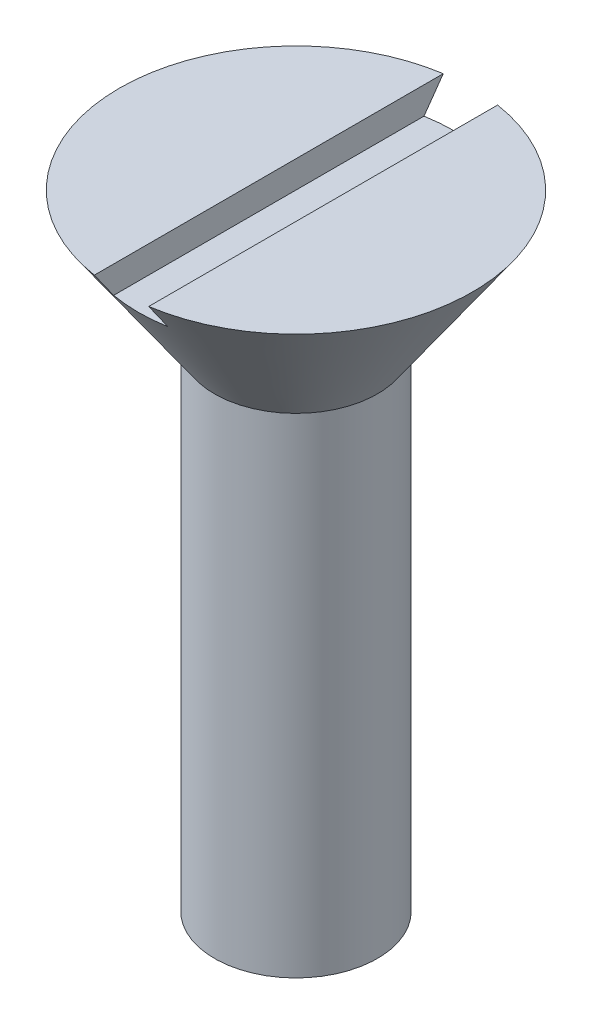
ISO-10303-21;
HEADER;
FILE_DESCRIPTION(('STEP AP214'),'2;1');
FILE_NAME('part.step','',(''),(''),'','','');
FILE_SCHEMA(('AUTOMOTIVE_DESIGN { 1 0 10303 214 1 1 1 1 }'));
ENDSEC;
DATA;
#1=APPLICATION_CONTEXT('core data for automotive mechanical design processes');
#2=APPLICATION_PROTOCOL_DEFINITION('international standard','automotive_design',2000,#1);
#3=PRODUCT_CONTEXT('',#1,'mechanical');
#4=PRODUCT('Part','Part','',(#3));
#5=PRODUCT_RELATED_PRODUCT_CATEGORY('part','',(#4));
#6=PRODUCT_DEFINITION_FORMATION('','',#4);
#7=PRODUCT_DEFINITION_CONTEXT('part definition',#1,'design');
#8=PRODUCT_DEFINITION('design','',#6,#7);
#9=PRODUCT_DEFINITION_SHAPE('','',#8);
#10=(LENGTH_UNIT() NAMED_UNIT(*) SI_UNIT(.MILLI.,.METRE.));
#11=(NAMED_UNIT(*) PLANE_ANGLE_UNIT() SI_UNIT($,.RADIAN.));
#12=(NAMED_UNIT(*) SI_UNIT($,.STERADIAN.) SOLID_ANGLE_UNIT());
#13=UNCERTAINTY_MEASURE_WITH_UNIT(LENGTH_MEASURE(1.E-05),#10,'distance_accuracy_value','');
#14=(GEOMETRIC_REPRESENTATION_CONTEXT(3) GLOBAL_UNCERTAINTY_ASSIGNED_CONTEXT((#13)) GLOBAL_UNIT_ASSIGNED_CONTEXT((#10,
#11,#12)) REPRESENTATION_CONTEXT('',''));
#15=CARTESIAN_POINT('',(0.,0.,0.));
#16=DIRECTION('',(0.,0.,1.));
#17=DIRECTION('',(1.,0.,0.));
#18=AXIS2_PLACEMENT_3D('',#15,#16,#17);
#19=CARTESIAN_POINT('',(0.,6.58769948751227,0.));
#20=DIRECTION('',(0.,-1.,0.));
#21=DIRECTION('',(1.,0.,0.));
#22=AXIS2_PLACEMENT_3D('',#19,#20,#21);
#23=PLANE('',#22);
#24=CARTESIAN_POINT('',(0.,6.58769948751227,0.));
#25=DIRECTION('',(0.,1.,0.));
#26=DIRECTION('',(-1.,0.,0.));
#27=AXIS2_PLACEMENT_3D('',#24,#25,#26);
#28=CIRCLE('',#27,6.5);
#29=CARTESIAN_POINT('',(-1.,6.58769948751227,-6.42261628933256));
#30=VERTEX_POINT('',#29);
#31=CARTESIAN_POINT('',(-1.,6.58769948751227,6.42261628933256));
#32=VERTEX_POINT('',#31);
#33=EDGE_CURVE('E94',#30,#32,#28,.T.);
#34=ORIENTED_EDGE('',*,*,#33,.T.);
#35=DIRECTION('',(0.,0.,-1.));
#36=VECTOR('',#35,1.);
#37=CARTESIAN_POINT('',(-1.,6.58769948751227,0.));
#38=LINE('',#37,#36);
#39=EDGE_CURVE('E82',#32,#30,#38,.T.);
#40=ORIENTED_EDGE('',*,*,#39,.T.);
#41=EDGE_LOOP('',(#34,#40));
#42=FACE_BOUND('',#41,.T.);
#43=ADVANCED_FACE('F35',(#42),#23,.F.);
#44=CARTESIAN_POINT('',(0.,6.58769948751227,0.));
#45=DIRECTION('',(0.,1.,0.));
#46=DIRECTION('',(-1.,0.,0.));
#47=AXIS2_PLACEMENT_3D('',#44,#45,#46);
#48=CONICAL_SURFACE('',#47,6.5,0.610725964389208);
#49=CARTESIAN_POINT('',(-1.,6.58839948751227,6.4231121927069));
#50=CARTESIAN_POINT('',(-1.,6.33729651430161,6.24521507547194));
#51=CARTESIAN_POINT('',(-1.,6.08626913875745,6.06721105785793));
#52=CARTESIAN_POINT('',(-1.,5.58441405277695,5.71088793330971));
#53=CARTESIAN_POINT('',(-1.,5.33358635610138,5.53256880699693));
#54=CARTESIAN_POINT('',(-1.,4.83145231436455,5.17499647886702));
#55=CARTESIAN_POINT('',(-1.,4.58014681874163,4.99574208349888));
#56=CARTESIAN_POINT('',(-1.,4.0779408416313,4.63669913452874));
#57=CARTESIAN_POINT('',(-1.,3.82704033641505,4.45691061411515));
#58=CARTESIAN_POINT('',(-1.,3.26703380809216,4.05434246098987));
#59=CARTESIAN_POINT('',(-1.,2.95807022967786,3.83136424535591));
#60=CARTESIAN_POINT('',(-1.,2.495632010554,3.49544297230532));
#61=CARTESIAN_POINT('',(-1.,2.34163797645068,3.38321524822286));
#62=CARTESIAN_POINT('',(-1.,2.03412187528826,3.15811915839283));
#63=CARTESIAN_POINT('',(-1.,1.88059980148758,3.04525080186236));
#64=CARTESIAN_POINT('',(-1.,1.57459812221442,2.81893473483322));
#65=CARTESIAN_POINT('',(-1.,1.4221168452968,2.70548928810727));
#66=CARTESIAN_POINT('',(-1.,1.11806893400657,2.47735955209802));
#67=CARTESIAN_POINT('',(-1.,0.966502353760784,2.36267519060135));
#68=CARTESIAN_POINT('',(-1.,0.66480771313235,2.13153400820381));
#69=CARTESIAN_POINT('',(-1.,0.514679139805757,2.01507786083154));
#70=CARTESIAN_POINT('',(-1.,0.291205162353113,1.83823431248961));
#71=CARTESIAN_POINT('',(-1.,0.217003881675928,1.77892951008025));
#72=CARTESIAN_POINT('',(-1.,0.0693671200385618,1.65937552484643));
#73=CARTESIAN_POINT('',(-1.,-0.00406838439784957,1.59912637111531));
#74=CARTESIAN_POINT('',(-1.,-0.125960246112539,1.49735496061013));
#75=CARTESIAN_POINT('',(-1.,-0.174703829091917,1.45617701216027));
#76=CARTESIAN_POINT('',(-1.,-0.271596442651019,1.37311830533831));
#77=CARTESIAN_POINT('',(-1.,-0.319745427139759,1.33123749306917));
#78=CARTESIAN_POINT('',(-1.,-0.415448285963826,1.24644783826053));
#79=CARTESIAN_POINT('',(-1.,-0.462999320856407,1.20353578171963));
#80=CARTESIAN_POINT('',(-1.,-0.557066403986683,1.11660199553977));
#81=CARTESIAN_POINT('',(-1.,-0.603582619965249,1.07258044824989));
#82=CARTESIAN_POINT('',(-1.,-0.694018357775428,0.984258875571621));
#83=CARTESIAN_POINT('',(-1.,-0.737973957512858,0.939995978319393));
#84=CARTESIAN_POINT('',(-1.,-0.824007994968062,0.849685965186155));
#85=CARTESIAN_POINT('',(-1.,-0.866086934492479,0.80363933249284));
#86=CARTESIAN_POINT('',(-1.,-0.947299092283439,0.709408627074625));
#87=CARTESIAN_POINT('',(-1.,-0.986446288804636,0.661236704334912));
#88=CARTESIAN_POINT('',(-1.,-1.06055652129322,0.561804744039557));
#89=CARTESIAN_POINT('',(-1.,-1.09552704953969,0.510550491890749));
#90=CARTESIAN_POINT('',(-1.,-1.13991893494819,0.43581143221311));
#91=CARTESIAN_POINT('',(-1.,-1.1521395471474,0.413994672182494));
#92=CARTESIAN_POINT('',(-1.,-1.17524806106656,0.369660988832995));
#93=CARTESIAN_POINT('',(-1.,-1.18613549046088,0.347143820893278));
#94=CARTESIAN_POINT('',(-1.,-1.21630380271337,0.278664441259215));
#95=CARTESIAN_POINT('',(-1.,-1.23320915527064,0.231583649581734));
#96=CARTESIAN_POINT('',(-1.,-1.25582632067389,0.143751659910726));
#97=CARTESIAN_POINT('',(-1.,-1.26300551642954,0.103387133416544));
#98=CARTESIAN_POINT('',(-1.,-1.27027537897089,0.021959403692384));
#99=CARTESIAN_POINT('',(-1.,-1.2703609902466,-0.0191042769698418));
#100=CARTESIAN_POINT('',(-1.,-1.26342102648394,-0.100503321516521));
#101=CARTESIAN_POINT('',(-1.,-1.25641121885668,-0.14084009842675));
#102=CARTESIAN_POINT('',(-1.,-1.23636265224426,-0.219934025983461));
#103=CARTESIAN_POINT('',(-1.,-1.22332281487366,-0.258690892735777));
#104=CARTESIAN_POINT('',(-1.,-1.19418084251646,-0.330465253321086));
#105=CARTESIAN_POINT('',(-1.,-1.1785196993124,-0.363667547268321));
#106=CARTESIAN_POINT('',(-1.,-1.14436057102044,-0.428595619012456));
#107=CARTESIAN_POINT('',(-1.,-1.12586002257051,-0.460320028527872));
#108=CARTESIAN_POINT('',(-1.,-1.08663279904995,-0.52258595066229));
#109=CARTESIAN_POINT('',(-1.,-1.06589453576314,-0.553120070167369));
#110=CARTESIAN_POINT('',(-1.,-1.02280615461857,-0.612996566707755));
#111=CARTESIAN_POINT('',(-1.,-1.00045677360621,-0.642339479063716));
#112=CARTESIAN_POINT('',(-1.,-0.930135368273727,-0.730686952033597));
#113=CARTESIAN_POINT('',(-1.,-0.880162230520118,-0.788092695306641));
#114=CARTESIAN_POINT('',(-1.,-0.777036581810065,-0.899994752825906));
#115=CARTESIAN_POINT('',(-1.,-0.723881252908808,-0.954488405025318));
#116=CARTESIAN_POINT('',(-1.,-0.615362324518045,-1.06149306115468));
#117=CARTESIAN_POINT('',(-1.,-0.559993592710082,-1.11399883295359));
#118=CARTESIAN_POINT('',(-1.,-0.447817482772299,-1.21745270602295));
#119=CARTESIAN_POINT('',(-1.,-0.391009929613301,-1.26840061610315));
#120=CARTESIAN_POINT('',(-1.,-0.275931673184634,-1.36949512242315));
#121=CARTESIAN_POINT('',(-1.,-0.217653186018853,-1.41963282838062));
#122=CARTESIAN_POINT('',(-1.,-0.100312042138735,-1.51898955075173));
#123=CARTESIAN_POINT('',(-1.,-0.0412493186868585,-1.56820848811067));
#124=CARTESIAN_POINT('',(-1.,0.0773680700816458,-1.66583472159214));
#125=CARTESIAN_POINT('',(-1.,0.136921688660588,-1.71424329188759));
#126=CARTESIAN_POINT('',(-1.,0.256493556204934,-1.81047784179123));
#127=CARTESIAN_POINT('',(-1.,0.316511788660996,-1.85830384194615));
#128=CARTESIAN_POINT('',(-1.,0.506121327784036,-2.00819700899556));
#129=CARTESIAN_POINT('',(-1.,0.636380742899398,-2.10941865781122));
#130=CARTESIAN_POINT('',(-1.,0.898004757006819,-2.31042525016909));
#131=CARTESIAN_POINT('',(-1.,1.02936939070065,-2.4102101483313));
#132=CARTESIAN_POINT('',(-1.,1.29287767090256,-2.60877175431692));
#133=CARTESIAN_POINT('',(-1.,1.4250213919166,-2.7075483631646));
#134=CARTESIAN_POINT('',(-1.,1.68986311814996,-2.90435620432971));
#135=CARTESIAN_POINT('',(-1.,1.82256112662948,-3.00238743225337));
#136=CARTESIAN_POINT('',(-1.,2.22155981504631,-3.29586613365334));
#137=CARTESIAN_POINT('',(-1.,2.48847321661308,-3.49048011542739));
#138=CARTESIAN_POINT('',(-1.,3.02325318031541,-3.8783582601765));
#139=CARTESIAN_POINT('',(-1.,3.29111968730831,-4.07162249938512));
#140=CARTESIAN_POINT('',(-1.,3.81115133212224,-4.44551854449072));
#141=CARTESIAN_POINT('',(-1.,4.06327887318551,-4.62620266343094));
#142=CARTESIAN_POINT('',(-1.,4.56793242853487,-4.98702305613861));
#143=CARTESIAN_POINT('',(-1.,4.82045845007364,-5.16715931975581));
#144=CARTESIAN_POINT('',(-1.,5.32543445558357,-5.52677185493383));
#145=CARTESIAN_POINT('',(-1.,5.57788402953781,-5.70624870244838));
#146=CARTESIAN_POINT('',(-1.,6.0829968265756,-6.06489037383144));
#147=CARTESIAN_POINT('',(-1.,6.33566004509323,-6.24405520412977));
#148=CARTESIAN_POINT('',(-1.,6.58839948751227,-6.4231121927069));
#149=B_SPLINE_CURVE_WITH_KNOTS('',3,(#49,#50,#51,#52,#53,#54,#55,#56,#57,#58,#59,#60,#61,#62,
#63,#64,#65,#66,#67,#68,#69,#70,#71,#72,#73,#74,#75,#76,#77,#78,#79,#80,#81,#82,#83,#84,#85,#86,
#87,#88,#89,#90,#91,#92,#93,#94,#95,#96,#97,#98,#99,#100,#101,#102,#103,#104,#105,#106,#107,
#108,#109,#110,#111,#112,#113,#114,#115,#116,#117,#118,#119,#120,#121,#122,#123,#124,#125,#126,
#127,#128,#129,#130,#131,#132,#133,#134,#135,#136,#137,#138,#139,#140,#141,#142,#143,#144,#145,
#146,#147,#148),.UNSPECIFIED.,.F.,.F.,(4,2,2,2,2,2,2,2,2,2,2,2,2,2,2,2,2,2,2,2,2,2,2,2,2,2,2,2,
2,2,2,2,2,2,2,2,2,2,2,2,2,2,2,2,2,2,2,2,2,4),(0.,0.923201509240992,1.84646192008956,
2.77251707641884,3.69851584706988,4.84157654201851,5.41322473304255,5.98486472022838,
6.55502115896762,7.12521101202564,7.6951892752624,7.98015070767564,8.26510337825439,
8.45652467666823,8.64796072134151,8.84010072326167,9.03220934955081,9.2193134976021,
9.40636731153534,9.59246346676998,9.77822061490547,9.85319794763916,9.92820176727317,
10.0775406581727,10.1999903842997,10.3225273780829,10.4447926671675,10.5670798301291,
10.6770443346272,10.7871087034044,10.8977732132442,11.0083874278571,11.2364917496226,
11.4648011428321,11.6936747166946,11.9225762674854,12.1531967152284,12.3838369158941,
12.6140718598638,12.8442986600009,13.3391746463811,13.8340662293547,14.3290059335491,
14.8239485529878,15.8149277270123,16.8058504703305,17.7364058749223,18.6669784163907,
19.5962168450814,20.5254358925289),.UNSPECIFIED.);
#150=CARTESIAN_POINT('',(-1.,5.58769948751227,-5.71314274283428));
#151=VERTEX_POINT('',#150);
#152=EDGE_CURVE('E90',#151,#30,#149,.T.);
#153=ORIENTED_EDGE('',*,*,#152,.F.);
#154=CARTESIAN_POINT('',(0.,5.58769948751227,0.));
#155=DIRECTION('',(0.,1.,0.));
#156=DIRECTION('',(0.,0.,1.));
#157=AXIS2_PLACEMENT_3D('',#154,#155,#156);
#158=CIRCLE('',#157,5.8);
#159=CARTESIAN_POINT('',(1.,5.58769948751227,-5.71314274283428));
#160=VERTEX_POINT('',#159);
#161=EDGE_CURVE('E11',#151,#160,#158,.F.);
#162=ORIENTED_EDGE('',*,*,#161,.T.);
#163=CARTESIAN_POINT('',(0.999999999999999,6.58839948751227,-6.4231121927069));
#164=CARTESIAN_POINT('',(0.999999999999999,6.33729651430161,-6.24521507547194));
#165=CARTESIAN_POINT('',(0.999999999999999,6.08626913875744,-6.06721105785793));
#166=CARTESIAN_POINT('',(0.999999999999999,5.58441405277694,-5.71088793330971));
#167=CARTESIAN_POINT('',(0.999999999999999,5.33358635610137,-5.53256880699692));
#168=CARTESIAN_POINT('',(0.999999999999999,4.83145231436454,-5.17499647886701));
#169=CARTESIAN_POINT('',(0.999999999999999,4.58014681874162,-4.99574208349887));
#170=CARTESIAN_POINT('',(0.999999999999999,4.07794084163129,-4.63669913452874));
#171=CARTESIAN_POINT('',(0.999999999999999,3.82704033641503,-4.45691061411514));
#172=CARTESIAN_POINT('',(0.999999999999999,3.26703380809215,-4.05434246098986));
#173=CARTESIAN_POINT('',(0.999999999999999,2.95807022967785,-3.8313642453559));
#174=CARTESIAN_POINT('',(0.999999999999999,2.49563201055399,-3.49544297230531));
#175=CARTESIAN_POINT('',(0.999999999999998,2.34163797645066,-3.38321524822285));
#176=CARTESIAN_POINT('',(0.999999999999998,2.03412187528824,-3.15811915839282));
#177=CARTESIAN_POINT('',(0.999999999999998,1.88059980148757,-3.04525080186235));
#178=CARTESIAN_POINT('',(0.999999999999998,1.57459812221441,-2.81893473483322));
#179=CARTESIAN_POINT('',(0.999999999999998,1.42211684529679,-2.70548928810726));
#180=CARTESIAN_POINT('',(0.999999999999998,1.11806893400656,-2.47735955209802));
#181=CARTESIAN_POINT('',(0.999999999999998,0.966502353760778,-2.36267519060135));
#182=CARTESIAN_POINT('',(0.999999999999998,0.664807713132346,-2.13153400820381));
#183=CARTESIAN_POINT('',(0.999999999999998,0.514679139805753,-2.01507786083154));
#184=CARTESIAN_POINT('',(0.999999999999998,0.29120516235311,-1.83823431248961));
#185=CARTESIAN_POINT('',(0.999999999999998,0.217003881675925,-1.77892951008025));
#186=CARTESIAN_POINT('',(0.999999999999998,0.06936712003856,-1.65937552484643));
#187=CARTESIAN_POINT('',(0.999999999999998,-0.00406838439785108,-1.59912637111531));
#188=CARTESIAN_POINT('',(0.999999999999998,-0.12596024611254,-1.49735496061013));
#189=CARTESIAN_POINT('',(0.999999999999998,-0.174703829091918,-1.45617701216028));
#190=CARTESIAN_POINT('',(0.999999999999998,-0.271596442651019,-1.37311830533831));
#191=CARTESIAN_POINT('',(0.999999999999998,-0.319745427139759,-1.33123749306917));
#192=CARTESIAN_POINT('',(0.999999999999998,-0.415448285963826,-1.24644783826053));
#193=CARTESIAN_POINT('',(0.999999999999998,-0.462999320856407,-1.20353578171964));
#194=CARTESIAN_POINT('',(0.999999999999998,-0.557066403986683,-1.11660199553977));
#195=CARTESIAN_POINT('',(0.999999999999998,-0.60358261996525,-1.07258044824989));
#196=CARTESIAN_POINT('',(0.999999999999998,-0.694018357775429,-0.984258875571623));
#197=CARTESIAN_POINT('',(0.999999999999998,-0.73797395751286,-0.939995978319395));
#198=CARTESIAN_POINT('',(0.999999999999998,-0.824007994968064,-0.849685965186157));
#199=CARTESIAN_POINT('',(0.999999999999998,-0.866086934492481,-0.803639332492843));
#200=CARTESIAN_POINT('',(0.999999999999998,-0.947299092283441,-0.709408627074628));
#201=CARTESIAN_POINT('',(0.999999999999998,-0.986446288804638,-0.661236704334916));
#202=CARTESIAN_POINT('',(0.999999999999998,-1.06055652129322,-0.561804744039559));
#203=CARTESIAN_POINT('',(0.999999999999998,-1.09552704953969,-0.510550491890751));
#204=CARTESIAN_POINT('',(0.999999999999998,-1.13991893494819,-0.435811432213112));
#205=CARTESIAN_POINT('',(0.999999999999998,-1.1521395471474,-0.413994672182495));
#206=CARTESIAN_POINT('',(0.999999999999998,-1.17524806106657,-0.369660988832997));
#207=CARTESIAN_POINT('',(0.999999999999998,-1.18613549046088,-0.34714382089328));
#208=CARTESIAN_POINT('',(0.999999999999998,-1.21630380271337,-0.278664441259217));
#209=CARTESIAN_POINT('',(0.999999999999998,-1.23320915527064,-0.231583649581737));
#210=CARTESIAN_POINT('',(0.999999999999998,-1.25582632067389,-0.143751659910728));
#211=CARTESIAN_POINT('',(0.999999999999998,-1.26300551642955,-0.103387133416547));
#212=CARTESIAN_POINT('',(0.999999999999998,-1.27027537897089,-0.0219594036923866));
#213=CARTESIAN_POINT('',(0.999999999999998,-1.2703609902466,0.0191042769698393));
#214=CARTESIAN_POINT('',(0.999999999999998,-1.26342102648394,0.100503321516519));
#215=CARTESIAN_POINT('',(0.999999999999998,-1.25641121885668,0.140840098426748));
#216=CARTESIAN_POINT('',(0.999999999999998,-1.23636265224427,0.219934025983459));
#217=CARTESIAN_POINT('',(0.999999999999998,-1.22332281487367,0.258690892735775));
#218=CARTESIAN_POINT('',(0.999999999999998,-1.19418084251646,0.330465253321083));
#219=CARTESIAN_POINT('',(0.999999999999998,-1.17851969931241,0.363667547268317));
#220=CARTESIAN_POINT('',(0.999999999999998,-1.14436057102044,0.428595619012451));
#221=CARTESIAN_POINT('',(0.999999999999998,-1.12586002257052,0.460320028527867));
#222=CARTESIAN_POINT('',(0.999999999999998,-1.08663279904996,0.522585950662285));
#223=CARTESIAN_POINT('',(0.999999999999998,-1.06589453576315,0.553120070167364));
#224=CARTESIAN_POINT('',(0.999999999999998,-1.02280615461858,0.612996566707749));
#225=CARTESIAN_POINT('',(0.999999999999998,-1.00045677360622,0.642339479063711));
#226=CARTESIAN_POINT('',(0.999999999999998,-0.930135368273737,0.730686952033592));
#227=CARTESIAN_POINT('',(0.999999999999998,-0.880162230520128,0.788092695306636));
#228=CARTESIAN_POINT('',(0.999999999999998,-0.777036581810075,0.899994752825899));
#229=CARTESIAN_POINT('',(0.999999999999998,-0.723881252908819,0.954488405025309));
#230=CARTESIAN_POINT('',(0.999999999999998,-0.615362324518057,1.06149306115467));
#231=CARTESIAN_POINT('',(0.999999999999998,-0.559993592710096,1.11399883295358));
#232=CARTESIAN_POINT('',(0.999999999999998,-0.447817482772315,1.21745270602294));
#233=CARTESIAN_POINT('',(0.999999999999998,-0.391009929613317,1.26840061610314));
#234=CARTESIAN_POINT('',(0.999999999999998,-0.275931673184652,1.36949512242314));
#235=CARTESIAN_POINT('',(0.999999999999998,-0.217653186018872,1.4196328283806));
#236=CARTESIAN_POINT('',(0.999999999999998,-0.100312042138756,1.51898955075171));
#237=CARTESIAN_POINT('',(0.999999999999998,-0.0412493186868805,1.56820848811066));
#238=CARTESIAN_POINT('',(0.999999999999998,0.0773680700816229,1.66583472159213));
#239=CARTESIAN_POINT('',(0.999999999999998,0.136921688660565,1.71424329188758));
#240=CARTESIAN_POINT('',(0.999999999999998,0.256493556204909,1.81047784179121));
#241=CARTESIAN_POINT('',(0.999999999999998,0.316511788660971,1.85830384194613));
#242=CARTESIAN_POINT('',(0.999999999999998,0.506121327784011,2.00819700899554));
#243=CARTESIAN_POINT('',(0.999999999999998,0.636380742899374,2.1094186578112));
#244=CARTESIAN_POINT('',(0.999999999999998,0.898004757006797,2.31042525016907));
#245=CARTESIAN_POINT('',(0.999999999999998,1.02936939070063,2.41021014833128));
#246=CARTESIAN_POINT('',(0.999999999999998,1.29287767090254,2.60877175431691));
#247=CARTESIAN_POINT('',(0.999999999999998,1.42502139191658,2.70754836316459));
#248=CARTESIAN_POINT('',(0.999999999999998,1.68986311814994,2.9043562043297));
#249=CARTESIAN_POINT('',(0.999999999999998,1.82256112662946,3.00238743225335));
#250=CARTESIAN_POINT('',(0.999999999999998,2.22155981504629,3.29586613365333));
#251=CARTESIAN_POINT('',(0.999999999999999,2.48847321661306,3.49048011542737));
#252=CARTESIAN_POINT('',(0.999999999999999,3.0232531803154,3.87835826017649));
#253=CARTESIAN_POINT('',(0.999999999999999,3.2911196873083,4.07162249938511));
#254=CARTESIAN_POINT('',(0.999999999999999,3.81115133212223,4.44551854449071));
#255=CARTESIAN_POINT('',(0.999999999999999,4.0632788731855,4.62620266343093));
#256=CARTESIAN_POINT('',(0.999999999999999,4.56793242853486,4.9870230561386));
#257=CARTESIAN_POINT('',(0.999999999999999,4.82045845007364,5.1671593197558));
#258=CARTESIAN_POINT('',(0.999999999999999,5.32543445558356,5.52677185493383));
#259=CARTESIAN_POINT('',(0.999999999999999,5.5778840295378,5.70624870244838));
#260=CARTESIAN_POINT('',(0.999999999999999,6.0829968265756,6.06489037383144));
#261=CARTESIAN_POINT('',(0.999999999999999,6.33566004509323,6.24405520412977));
#262=CARTESIAN_POINT('',(0.999999999999999,6.58839948751227,6.4231121927069));
#263=B_SPLINE_CURVE_WITH_KNOTS('',3,(#163,#164,#165,#166,#167,#168,#169,#170,#171,#172,#173,
#174,#175,#176,#177,#178,#179,#180,#181,#182,#183,#184,#185,#186,#187,#188,#189,#190,#191,#192,
#193,#194,#195,#196,#197,#198,#199,#200,#201,#202,#203,#204,#205,#206,#207,#208,#209,#210,#211,
#212,#213,#214,#215,#216,#217,#218,#219,#220,#221,#222,#223,#224,#225,#226,#227,#228,#229,#230,
#231,#232,#233,#234,#235,#236,#237,#238,#239,#240,#241,#242,#243,#244,#245,#246,#247,#248,#249,
#250,#251,#252,#253,#254,#255,#256,#257,#258,#259,#260,#261,#262),.UNSPECIFIED.,.F.,.F.,(4,2,2,
2,2,2,2,2,2,2,2,2,2,2,2,2,2,2,2,2,2,2,2,2,2,2,2,2,2,2,2,2,2,2,2,2,2,2,2,2,2,2,2,2,2,2,2,2,2,4),
(0.,0.923201509240997,1.84646192008957,2.77251707641885,3.6985158470699,4.84157654201853,
5.41322473304256,5.9848647202284,6.55502115896763,7.12521101202565,7.69518927526241,
7.98015070767564,8.26510337825439,8.45652467666823,8.64796072134151,8.84010072326167,
9.03220934955081,9.2193134976021,9.40636731153534,9.59246346676998,9.77822061490547,
9.85319794763916,9.92820176727317,10.0775406581727,10.1999903842997,10.3225273780829,
10.4447926671675,10.5670798301291,10.6770443346272,10.7871087034044,10.8977732132442,
11.0083874278571,11.2364917496226,11.4648011428321,11.6936747166945,11.9225762674853,
12.1531967152284,12.3838369158941,12.6140718598638,12.8442986600009,13.3391746463811,
13.8340662293546,14.3290059335491,14.8239485529878,15.8149277270123,16.8058504703305,
17.7364058749223,18.6669784163907,19.5962168450814,20.5254358925289),.UNSPECIFIED.);
#264=CARTESIAN_POINT('',(0.999999999999999,6.58769948751227,-6.42261628933256));
#265=VERTEX_POINT('',#264);
#266=EDGE_CURVE('E77',#265,#160,#263,.T.);
#267=ORIENTED_EDGE('',*,*,#266,.F.);
#268=CARTESIAN_POINT('',(0.999999999999999,6.58769948751227,6.42261628933256));
#269=VERTEX_POINT('',#268);
#270=EDGE_CURVE('E89',#269,#265,#28,.T.);
#271=ORIENTED_EDGE('',*,*,#270,.F.);
#272=CARTESIAN_POINT('',(1.,5.58769948751227,5.71314274283428));
#273=VERTEX_POINT('',#272);
#274=EDGE_CURVE('E50',#273,#269,#263,.T.);
#275=ORIENTED_EDGE('',*,*,#274,.F.);
#276=CARTESIAN_POINT('',(-1.,5.58769948751227,5.71314274283428));
#277=VERTEX_POINT('',#276);
#278=EDGE_CURVE('E39',#273,#277,#158,.F.);
#279=ORIENTED_EDGE('',*,*,#278,.T.);
#280=EDGE_CURVE('E99',#32,#277,#149,.T.);
#281=ORIENTED_EDGE('',*,*,#280,.F.);
#282=ORIENTED_EDGE('',*,*,#33,.F.);
#283=EDGE_LOOP('',(#153,#162,#267,#271,#275,#279,#281,#282));
#284=FACE_BOUND('',#283,.T.);
#285=CARTESIAN_POINT('',(0.,1.58769948751227,0.));
#286=DIRECTION('',(0.,1.,0.));
#287=DIRECTION('',(-1.,0.,0.));
#288=AXIS2_PLACEMENT_3D('',#285,#286,#287);
#289=CIRCLE('',#288,3.);
#290=CARTESIAN_POINT('',(-3.,1.58769948751227,0.));
#291=VERTEX_POINT('',#290);
#292=EDGE_CURVE('E93',#291,#291,#289,.T.);
#293=ORIENTED_EDGE('',*,*,#292,.T.);
#294=EDGE_LOOP('',(#293));
#295=FACE_BOUND('',#294,.T.);
#296=ADVANCED_FACE('F87',(#284,#295),#48,.T.);
#297=ORIENTED_EDGE('',*,*,#270,.T.);
#298=DIRECTION('',(0.,0.,1.));
#299=VECTOR('',#298,1.);
#300=CARTESIAN_POINT('',(0.999999999999999,6.58769948751227,0.));
#301=LINE('',#300,#299);
#302=EDGE_CURVE('E74',#265,#269,#301,.T.);
#303=ORIENTED_EDGE('',*,*,#302,.T.);
#304=EDGE_LOOP('',(#297,#303));
#305=FACE_BOUND('',#304,.T.);
#306=ADVANCED_FACE('F92',(#305),#23,.F.);
#307=CARTESIAN_POINT('',(0.,6.58769948751227,0.));
#308=DIRECTION('',(0.,1.,0.));
#309=DIRECTION('',(-1.,0.,0.));
#310=AXIS2_PLACEMENT_3D('',#307,#308,#309);
#311=CYLINDRICAL_SURFACE('',#310,3.);
#312=ORIENTED_EDGE('',*,*,#292,.F.);
#313=EDGE_LOOP('',(#312));
#314=FACE_BOUND('',#313,.T.);
#315=CARTESIAN_POINT('',(0.,-16.4123005124877,0.));
#316=DIRECTION('',(0.,1.,0.));
#317=DIRECTION('',(-1.,0.,0.));
#318=AXIS2_PLACEMENT_3D('',#315,#316,#317);
#319=CIRCLE('',#318,3.);
#320=CARTESIAN_POINT('',(-3.,-16.4123005124877,0.));
#321=VERTEX_POINT('',#320);
#322=EDGE_CURVE('E83',#321,#321,#319,.T.);
#323=ORIENTED_EDGE('',*,*,#322,.T.);
#324=EDGE_LOOP('',(#323));
#325=FACE_BOUND('',#324,.T.);
#326=ADVANCED_FACE('F135',(#314,#325),#311,.T.);
#327=CARTESIAN_POINT('',(0.,-18.1443513200566,0.));
#328=DIRECTION('',(0.,1.,0.));
#329=DIRECTION('',(-1.,0.,0.));
#330=AXIS2_PLACEMENT_3D('',#327,#328,#329);
#331=CONICAL_SURFACE('',#330,0.,1.04719755119659);
#332=ORIENTED_EDGE('',*,*,#322,.F.);
#333=EDGE_LOOP('',(#332));
#334=FACE_BOUND('',#333,.T.);
#335=CARTESIAN_POINT('',(0.,-18.1443513200566,0.));
#336=VERTEX_POINT('',#335);
#337=VERTEX_LOOP('',#336);
#338=FACE_BOUND('',#337,.T.);
#339=ADVANCED_FACE('F37',(#334,#338),#331,.T.);
#340=CARTESIAN_POINT('',(-1.,5.58769948751227,6.42261628933256));
#341=DIRECTION('',(-1.,0.,0.));
#342=DIRECTION('',(0.,-1.,0.));
#343=AXIS2_PLACEMENT_3D('',#340,#341,#342);
#344=PLANE('',#343);
#345=ORIENTED_EDGE('',*,*,#280,.T.);
#346=DIRECTION('',(0.,0.,1.));
#347=VECTOR('',#346,1.);
#348=CARTESIAN_POINT('',(-1.,5.58769948751227,-6.42261628933257));
#349=LINE('',#348,#347);
#350=EDGE_CURVE('E119',#151,#277,#349,.T.);
#351=ORIENTED_EDGE('',*,*,#350,.F.);
#352=ORIENTED_EDGE('',*,*,#152,.T.);
#353=ORIENTED_EDGE('',*,*,#39,.F.);
#354=EDGE_LOOP('',(#345,#351,#352,#353));
#355=FACE_BOUND('',#354,.T.);
#356=ADVANCED_FACE('F131',(#355),#344,.F.);
#357=CARTESIAN_POINT('',(0.999999999999999,5.58769948751227,-6.9862141658632));
#358=DIRECTION('',(1.,0.,0.));
#359=DIRECTION('',(0.,1.,0.));
#360=AXIS2_PLACEMENT_3D('',#357,#358,#359);
#361=PLANE('',#360);
#362=ORIENTED_EDGE('',*,*,#266,.T.);
#363=DIRECTION('',(0.,0.,-1.));
#364=VECTOR('',#363,1.);
#365=CARTESIAN_POINT('',(1.,5.58769948751227,6.62289664420257));
#366=LINE('',#365,#364);
#367=EDGE_CURVE('E117',#273,#160,#366,.T.);
#368=ORIENTED_EDGE('',*,*,#367,.F.);
#369=ORIENTED_EDGE('',*,*,#274,.T.);
#370=ORIENTED_EDGE('',*,*,#302,.F.);
#371=EDGE_LOOP('',(#362,#368,#369,#370));
#372=FACE_BOUND('',#371,.T.);
#373=ADVANCED_FACE('F76',(#372),#361,.F.);
#374=CARTESIAN_POINT('',(0.,5.58769948751227,0.));
#375=DIRECTION('',(0.,1.,0.));
#376=DIRECTION('',(0.,0.,1.));
#377=AXIS2_PLACEMENT_3D('',#374,#375,#376);
#378=PLANE('',#377);
#379=ORIENTED_EDGE('',*,*,#350,.T.);
#380=ORIENTED_EDGE('',*,*,#278,.F.);
#381=ORIENTED_EDGE('',*,*,#367,.T.);
#382=ORIENTED_EDGE('',*,*,#161,.F.);
#383=EDGE_LOOP('',(#379,#380,#381,#382));
#384=FACE_BOUND('',#383,.T.);
#385=ADVANCED_FACE('F116',(#384),#378,.T.);
#386=CLOSED_SHELL('',(#43,#296,#306,#326,#339,#356,#373,#385));
#387=MANIFOLD_SOLID_BREP('B2',#386);
#388=ADVANCED_BREP_SHAPE_REPRESENTATION('',(#18,#387),#14);
#389=SHAPE_DEFINITION_REPRESENTATION(#9,#388);
ENDSEC;
END-ISO-10303-21;
